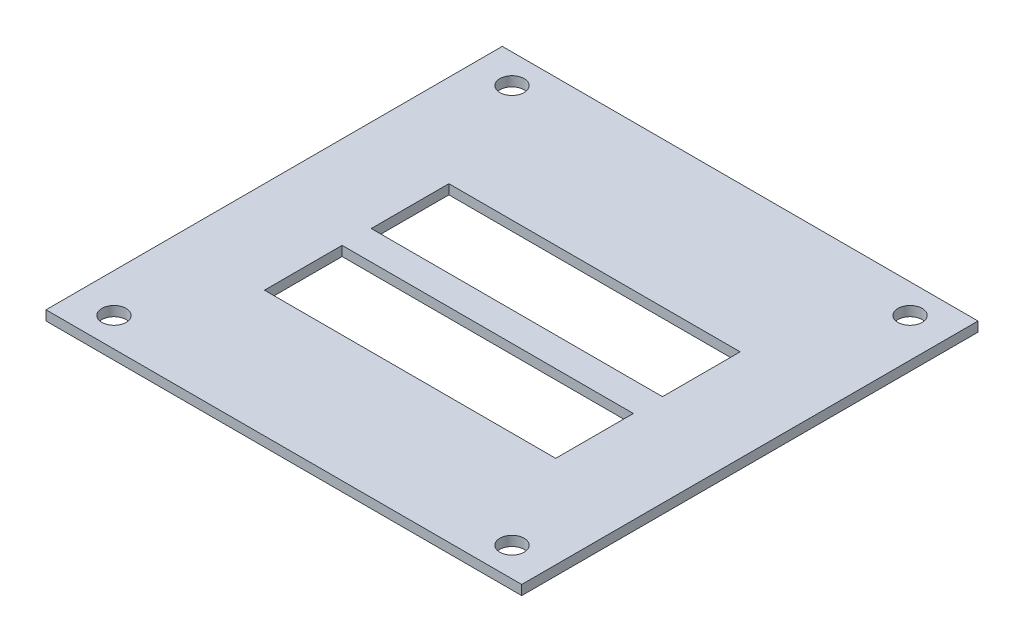
ISO-10303-21;
HEADER;
FILE_DESCRIPTION(('STEP AP214'),'2;1');
FILE_NAME('part.step','',(''),(''),'','','');
FILE_SCHEMA(('AUTOMOTIVE_DESIGN { 1 0 10303 214 1 1 1 1 }'));
ENDSEC;
DATA;
#1=APPLICATION_CONTEXT('core data for automotive mechanical design processes');
#2=APPLICATION_PROTOCOL_DEFINITION('international standard','automotive_design',2000,#1);
#3=PRODUCT_CONTEXT('',#1,'mechanical');
#4=PRODUCT('Part','Part','',(#3));
#5=PRODUCT_RELATED_PRODUCT_CATEGORY('part','',(#4));
#6=PRODUCT_DEFINITION_FORMATION('','',#4);
#7=PRODUCT_DEFINITION_CONTEXT('part definition',#1,'design');
#8=PRODUCT_DEFINITION('design','',#6,#7);
#9=PRODUCT_DEFINITION_SHAPE('','',#8);
#10=(LENGTH_UNIT() NAMED_UNIT(*) SI_UNIT(.MILLI.,.METRE.));
#11=(NAMED_UNIT(*) PLANE_ANGLE_UNIT() SI_UNIT($,.RADIAN.));
#12=(NAMED_UNIT(*) SI_UNIT($,.STERADIAN.) SOLID_ANGLE_UNIT());
#13=UNCERTAINTY_MEASURE_WITH_UNIT(LENGTH_MEASURE(1.E-05),#10,'distance_accuracy_value','');
#14=(GEOMETRIC_REPRESENTATION_CONTEXT(3) GLOBAL_UNCERTAINTY_ASSIGNED_CONTEXT((#13)) GLOBAL_UNIT_ASSIGNED_CONTEXT((#10,
#11,#12)) REPRESENTATION_CONTEXT('',''));
#15=CARTESIAN_POINT('',(0.,0.,0.));
#16=DIRECTION('',(0.,0.,1.));
#17=DIRECTION('',(1.,0.,0.));
#18=AXIS2_PLACEMENT_3D('',#15,#16,#17);
#19=CARTESIAN_POINT('',(0.,1.,-47.));
#20=DIRECTION('',(1.,0.,0.));
#21=DIRECTION('',(0.,0.,-1.));
#22=AXIS2_PLACEMENT_3D('',#19,#20,#21);
#23=PLANE('',#22);
#24=DIRECTION('',(0.,0.,1.));
#25=VECTOR('',#24,1.);
#26=CARTESIAN_POINT('',(0.,0.,-47.));
#27=LINE('',#26,#25);
#28=CARTESIAN_POINT('',(0.,0.,-47.));
#29=VERTEX_POINT('',#28);
#30=CARTESIAN_POINT('',(0.,0.,0.));
#31=VERTEX_POINT('',#30);
#32=EDGE_CURVE('E212',#29,#31,#27,.T.);
#33=ORIENTED_EDGE('',*,*,#32,.T.);
#34=DIRECTION('',(0.,-1.,0.));
#35=VECTOR('',#34,1.);
#36=CARTESIAN_POINT('',(0.,1.,0.));
#37=LINE('',#36,#35);
#38=CARTESIAN_POINT('',(0.,1.,0.));
#39=VERTEX_POINT('',#38);
#40=EDGE_CURVE('E11',#39,#31,#37,.T.);
#41=ORIENTED_EDGE('',*,*,#40,.F.);
#42=DIRECTION('',(0.,0.,1.));
#43=VECTOR('',#42,1.);
#44=CARTESIAN_POINT('',(0.,1.,-47.));
#45=LINE('',#44,#43);
#46=CARTESIAN_POINT('',(0.,1.,-47.));
#47=VERTEX_POINT('',#46);
#48=EDGE_CURVE('E213',#47,#39,#45,.T.);
#49=ORIENTED_EDGE('',*,*,#48,.F.);
#50=DIRECTION('',(0.,-1.,0.));
#51=VECTOR('',#50,1.);
#52=CARTESIAN_POINT('',(0.,1.,-47.));
#53=LINE('',#52,#51);
#54=EDGE_CURVE('E223',#47,#29,#53,.T.);
#55=ORIENTED_EDGE('',*,*,#54,.T.);
#56=EDGE_LOOP('',(#33,#41,#49,#55));
#57=FACE_BOUND('',#56,.T.);
#58=ADVANCED_FACE('F33',(#57),#23,.F.);
#59=CARTESIAN_POINT('',(0.,1.,0.));
#60=DIRECTION('',(0.,0.,-1.));
#61=DIRECTION('',(-1.,0.,0.));
#62=AXIS2_PLACEMENT_3D('',#59,#60,#61);
#63=PLANE('',#62);
#64=DIRECTION('',(1.,0.,0.));
#65=VECTOR('',#64,1.);
#66=CARTESIAN_POINT('',(0.,0.,0.));
#67=LINE('',#66,#65);
#68=CARTESIAN_POINT('',(49.,0.,0.));
#69=VERTEX_POINT('',#68);
#70=EDGE_CURVE('E226',#31,#69,#67,.T.);
#71=ORIENTED_EDGE('',*,*,#70,.T.);
#72=DIRECTION('',(0.,-1.,0.));
#73=VECTOR('',#72,1.);
#74=CARTESIAN_POINT('',(49.,1.,0.));
#75=LINE('',#74,#73);
#76=CARTESIAN_POINT('',(49.,1.,0.));
#77=VERTEX_POINT('',#76);
#78=EDGE_CURVE('E40',#77,#69,#75,.T.);
#79=ORIENTED_EDGE('',*,*,#78,.F.);
#80=DIRECTION('',(1.,0.,0.));
#81=VECTOR('',#80,1.);
#82=CARTESIAN_POINT('',(0.,1.,0.));
#83=LINE('',#82,#81);
#84=EDGE_CURVE('E216',#39,#77,#83,.T.);
#85=ORIENTED_EDGE('',*,*,#84,.F.);
#86=ORIENTED_EDGE('',*,*,#40,.T.);
#87=EDGE_LOOP('',(#71,#79,#85,#86));
#88=FACE_BOUND('',#87,.T.);
#89=ADVANCED_FACE('F255',(#88),#63,.F.);
#90=CARTESIAN_POINT('',(49.,1.,-47.));
#91=DIRECTION('',(-1.,0.,0.));
#92=DIRECTION('',(0.,0.,1.));
#93=AXIS2_PLACEMENT_3D('',#90,#91,#92);
#94=PLANE('',#93);
#95=DIRECTION('',(0.,0.,-1.));
#96=VECTOR('',#95,1.);
#97=CARTESIAN_POINT('',(49.,0.,-47.));
#98=LINE('',#97,#96);
#99=CARTESIAN_POINT('',(49.,0.,-47.));
#100=VERTEX_POINT('',#99);
#101=EDGE_CURVE('E228',#69,#100,#98,.T.);
#102=ORIENTED_EDGE('',*,*,#101,.T.);
#103=DIRECTION('',(0.,-1.,0.));
#104=VECTOR('',#103,1.);
#105=CARTESIAN_POINT('',(49.,1.,-47.));
#106=LINE('',#105,#104);
#107=CARTESIAN_POINT('',(49.,1.,-47.));
#108=VERTEX_POINT('',#107);
#109=EDGE_CURVE('E233',#108,#100,#106,.T.);
#110=ORIENTED_EDGE('',*,*,#109,.F.);
#111=DIRECTION('',(0.,0.,-1.));
#112=VECTOR('',#111,1.);
#113=CARTESIAN_POINT('',(49.,1.,-47.));
#114=LINE('',#113,#112);
#115=EDGE_CURVE('E219',#77,#108,#114,.T.);
#116=ORIENTED_EDGE('',*,*,#115,.F.);
#117=ORIENTED_EDGE('',*,*,#78,.T.);
#118=EDGE_LOOP('',(#102,#110,#116,#117));
#119=FACE_BOUND('',#118,.T.);
#120=ADVANCED_FACE('F240',(#119),#94,.F.);
#121=CARTESIAN_POINT('',(0.,1.,-47.));
#122=DIRECTION('',(0.,0.,1.));
#123=DIRECTION('',(1.,0.,0.));
#124=AXIS2_PLACEMENT_3D('',#121,#122,#123);
#125=PLANE('',#124);
#126=DIRECTION('',(-1.,0.,0.));
#127=VECTOR('',#126,1.);
#128=CARTESIAN_POINT('',(0.,0.,-47.));
#129=LINE('',#128,#127);
#130=EDGE_CURVE('E217',#100,#29,#129,.T.);
#131=ORIENTED_EDGE('',*,*,#130,.T.);
#132=ORIENTED_EDGE('',*,*,#54,.F.);
#133=DIRECTION('',(-1.,0.,0.));
#134=VECTOR('',#133,1.);
#135=CARTESIAN_POINT('',(0.,1.,-47.));
#136=LINE('',#135,#134);
#137=EDGE_CURVE('E221',#108,#47,#136,.T.);
#138=ORIENTED_EDGE('',*,*,#137,.F.);
#139=ORIENTED_EDGE('',*,*,#109,.T.);
#140=EDGE_LOOP('',(#131,#132,#138,#139));
#141=FACE_BOUND('',#140,.T.);
#142=ADVANCED_FACE('F248',(#141),#125,.F.);
#143=CARTESIAN_POINT('',(0.,1.,0.));
#144=DIRECTION('',(0.,1.,0.));
#145=DIRECTION('',(0.,0.,1.));
#146=AXIS2_PLACEMENT_3D('',#143,#144,#145);
#147=PLANE('',#146);
#148=DIRECTION('',(0.,0.,-1.));
#149=VECTOR('',#148,1.);
#150=CARTESIAN_POINT('',(39.5,1.,-32.));
#151=LINE('',#150,#149);
#152=CARTESIAN_POINT('',(39.5,1.,-24.));
#153=VERTEX_POINT('',#152);
#154=CARTESIAN_POINT('',(39.5,1.,-32.));
#155=VERTEX_POINT('',#154);
#156=EDGE_CURVE('E47',#153,#155,#151,.T.);
#157=ORIENTED_EDGE('',*,*,#156,.F.);
#158=DIRECTION('',(1.,0.,0.));
#159=VECTOR('',#158,1.);
#160=CARTESIAN_POINT('',(39.5,1.,-24.));
#161=LINE('',#160,#159);
#162=CARTESIAN_POINT('',(9.49999999999999,1.,-24.));
#163=VERTEX_POINT('',#162);
#164=EDGE_CURVE('E129',#163,#153,#161,.T.);
#165=ORIENTED_EDGE('',*,*,#164,.F.);
#166=DIRECTION('',(0.,0.,1.));
#167=VECTOR('',#166,1.);
#168=CARTESIAN_POINT('',(9.49999999999999,1.,-32.));
#169=LINE('',#168,#167);
#170=CARTESIAN_POINT('',(9.49999999999999,1.,-32.));
#171=VERTEX_POINT('',#170);
#172=EDGE_CURVE('E149',#171,#163,#169,.T.);
#173=ORIENTED_EDGE('',*,*,#172,.F.);
#174=DIRECTION('',(-1.,0.,0.));
#175=VECTOR('',#174,1.);
#176=CARTESIAN_POINT('',(39.5,1.,-32.));
#177=LINE('',#176,#175);
#178=EDGE_CURVE('E143',#155,#171,#177,.T.);
#179=ORIENTED_EDGE('',*,*,#178,.F.);
#180=EDGE_LOOP('',(#157,#165,#173,#179));
#181=FACE_BOUND('',#180,.T.);
#182=DIRECTION('',(0.,0.,-1.));
#183=VECTOR('',#182,1.);
#184=CARTESIAN_POINT('',(39.5,1.,-13.));
#185=LINE('',#184,#183);
#186=CARTESIAN_POINT('',(39.5,1.,-13.));
#187=VERTEX_POINT('',#186);
#188=CARTESIAN_POINT('',(39.5,1.,-21.));
#189=VERTEX_POINT('',#188);
#190=EDGE_CURVE('E165',#187,#189,#185,.T.);
#191=ORIENTED_EDGE('',*,*,#190,.F.);
#192=DIRECTION('',(1.,0.,0.));
#193=VECTOR('',#192,1.);
#194=CARTESIAN_POINT('',(39.5,1.,-13.));
#195=LINE('',#194,#193);
#196=CARTESIAN_POINT('',(9.49999999999999,1.,-13.));
#197=VERTEX_POINT('',#196);
#198=EDGE_CURVE('E173',#197,#187,#195,.T.);
#199=ORIENTED_EDGE('',*,*,#198,.F.);
#200=DIRECTION('',(0.,0.,1.));
#201=VECTOR('',#200,1.);
#202=CARTESIAN_POINT('',(9.49999999999999,1.,-13.));
#203=LINE('',#202,#201);
#204=CARTESIAN_POINT('',(9.49999999999999,1.,-21.));
#205=VERTEX_POINT('',#204);
#206=EDGE_CURVE('E170',#205,#197,#203,.T.);
#207=ORIENTED_EDGE('',*,*,#206,.F.);
#208=DIRECTION('',(-1.,0.,0.));
#209=VECTOR('',#208,1.);
#210=CARTESIAN_POINT('',(39.5,1.,-21.));
#211=LINE('',#210,#209);
#212=EDGE_CURVE('E167',#189,#205,#211,.T.);
#213=ORIENTED_EDGE('',*,*,#212,.F.);
#214=EDGE_LOOP('',(#191,#199,#207,#213));
#215=FACE_BOUND('',#214,.T.);
#216=CARTESIAN_POINT('',(3.99999999999999,1.,-44.));
#217=DIRECTION('',(0.,1.,0.));
#218=DIRECTION('',(0.,0.,1.));
#219=AXIS2_PLACEMENT_3D('',#216,#217,#218);
#220=CIRCLE('',#219,1.24999999999999);
#221=CARTESIAN_POINT('',(3.99999999999999,1.,-42.75));
#222=VERTEX_POINT('',#221);
#223=EDGE_CURVE('E188',#222,#222,#220,.T.);
#224=ORIENTED_EDGE('',*,*,#223,.F.);
#225=EDGE_LOOP('',(#224));
#226=FACE_BOUND('',#225,.T.);
#227=CARTESIAN_POINT('',(4.,1.,-3.));
#228=DIRECTION('',(0.,1.,0.));
#229=DIRECTION('',(0.,0.,1.));
#230=AXIS2_PLACEMENT_3D('',#227,#228,#229);
#231=CIRCLE('',#230,1.24999999999999);
#232=CARTESIAN_POINT('',(4.,1.,-1.75000000000002));
#233=VERTEX_POINT('',#232);
#234=EDGE_CURVE('E194',#233,#233,#231,.T.);
#235=ORIENTED_EDGE('',*,*,#234,.F.);
#236=EDGE_LOOP('',(#235));
#237=FACE_BOUND('',#236,.T.);
#238=CARTESIAN_POINT('',(45.,1.,-3.));
#239=DIRECTION('',(0.,1.,0.));
#240=DIRECTION('',(0.,0.,1.));
#241=AXIS2_PLACEMENT_3D('',#238,#239,#240);
#242=CIRCLE('',#241,1.24999999999999);
#243=CARTESIAN_POINT('',(45.,1.,-1.75000000000002));
#244=VERTEX_POINT('',#243);
#245=EDGE_CURVE('E200',#244,#244,#242,.T.);
#246=ORIENTED_EDGE('',*,*,#245,.F.);
#247=EDGE_LOOP('',(#246));
#248=FACE_BOUND('',#247,.T.);
#249=CARTESIAN_POINT('',(45.,1.,-44.));
#250=DIRECTION('',(0.,1.,0.));
#251=DIRECTION('',(0.,0.,1.));
#252=AXIS2_PLACEMENT_3D('',#249,#250,#251);
#253=CIRCLE('',#252,1.24999999999999);
#254=CARTESIAN_POINT('',(45.,1.,-42.75));
#255=VERTEX_POINT('',#254);
#256=EDGE_CURVE('E206',#255,#255,#253,.T.);
#257=ORIENTED_EDGE('',*,*,#256,.F.);
#258=EDGE_LOOP('',(#257));
#259=FACE_BOUND('',#258,.T.);
#260=ORIENTED_EDGE('',*,*,#48,.T.);
#261=ORIENTED_EDGE('',*,*,#84,.T.);
#262=ORIENTED_EDGE('',*,*,#115,.T.);
#263=ORIENTED_EDGE('',*,*,#137,.T.);
#264=EDGE_LOOP('',(#260,#261,#262,#263));
#265=FACE_BOUND('',#264,.T.);
#266=ADVANCED_FACE('F254',(#181,#215,#226,#237,#248,#259,#265),#147,.T.);
#267=CARTESIAN_POINT('',(0.,0.,0.));
#268=DIRECTION('',(0.,1.,0.));
#269=DIRECTION('',(0.,0.,1.));
#270=AXIS2_PLACEMENT_3D('',#267,#268,#269);
#271=PLANE('',#270);
#272=DIRECTION('',(-1.,0.,0.));
#273=VECTOR('',#272,1.);
#274=CARTESIAN_POINT('',(39.5,0.,-24.));
#275=LINE('',#274,#273);
#276=CARTESIAN_POINT('',(39.5,0.,-24.));
#277=VERTEX_POINT('',#276);
#278=CARTESIAN_POINT('',(9.49999999999999,0.,-24.));
#279=VERTEX_POINT('',#278);
#280=EDGE_CURVE('E141',#277,#279,#275,.T.);
#281=ORIENTED_EDGE('',*,*,#280,.F.);
#282=DIRECTION('',(0.,0.,1.));
#283=VECTOR('',#282,1.);
#284=CARTESIAN_POINT('',(39.5,0.,-32.));
#285=LINE('',#284,#283);
#286=CARTESIAN_POINT('',(39.5,0.,-32.));
#287=VERTEX_POINT('',#286);
#288=EDGE_CURVE('E123',#287,#277,#285,.T.);
#289=ORIENTED_EDGE('',*,*,#288,.F.);
#290=DIRECTION('',(1.,0.,0.));
#291=VECTOR('',#290,1.);
#292=CARTESIAN_POINT('',(39.5,0.,-32.));
#293=LINE('',#292,#291);
#294=CARTESIAN_POINT('',(9.49999999999999,0.,-32.));
#295=VERTEX_POINT('',#294);
#296=EDGE_CURVE('E132',#295,#287,#293,.T.);
#297=ORIENTED_EDGE('',*,*,#296,.F.);
#298=DIRECTION('',(0.,0.,-1.));
#299=VECTOR('',#298,1.);
#300=CARTESIAN_POINT('',(9.49999999999999,0.,-32.));
#301=LINE('',#300,#299);
#302=EDGE_CURVE('E55',#279,#295,#301,.T.);
#303=ORIENTED_EDGE('',*,*,#302,.F.);
#304=EDGE_LOOP('',(#281,#289,#297,#303));
#305=FACE_BOUND('',#304,.T.);
#306=DIRECTION('',(-1.,0.,0.));
#307=VECTOR('',#306,1.);
#308=CARTESIAN_POINT('',(39.5,0.,-13.));
#309=LINE('',#308,#307);
#310=CARTESIAN_POINT('',(39.5,0.,-13.));
#311=VERTEX_POINT('',#310);
#312=CARTESIAN_POINT('',(9.49999999999999,0.,-13.));
#313=VERTEX_POINT('',#312);
#314=EDGE_CURVE('E159',#311,#313,#309,.T.);
#315=ORIENTED_EDGE('',*,*,#314,.F.);
#316=DIRECTION('',(0.,0.,1.));
#317=VECTOR('',#316,1.);
#318=CARTESIAN_POINT('',(39.5,0.,-13.));
#319=LINE('',#318,#317);
#320=CARTESIAN_POINT('',(39.5,0.,-21.));
#321=VERTEX_POINT('',#320);
#322=EDGE_CURVE('E162',#321,#311,#319,.T.);
#323=ORIENTED_EDGE('',*,*,#322,.F.);
#324=DIRECTION('',(1.,0.,0.));
#325=VECTOR('',#324,1.);
#326=CARTESIAN_POINT('',(39.5,0.,-21.));
#327=LINE('',#326,#325);
#328=CARTESIAN_POINT('',(9.49999999999999,0.,-21.));
#329=VERTEX_POINT('',#328);
#330=EDGE_CURVE('E179',#329,#321,#327,.T.);
#331=ORIENTED_EDGE('',*,*,#330,.F.);
#332=DIRECTION('',(0.,0.,-1.));
#333=VECTOR('',#332,1.);
#334=CARTESIAN_POINT('',(9.49999999999999,0.,-13.));
#335=LINE('',#334,#333);
#336=EDGE_CURVE('E135',#313,#329,#335,.T.);
#337=ORIENTED_EDGE('',*,*,#336,.F.);
#338=EDGE_LOOP('',(#315,#323,#331,#337));
#339=FACE_BOUND('',#338,.T.);
#340=CARTESIAN_POINT('',(3.99999999999999,0.,-44.));
#341=DIRECTION('',(0.,1.,0.));
#342=DIRECTION('',(0.,0.,1.));
#343=AXIS2_PLACEMENT_3D('',#340,#341,#342);
#344=CIRCLE('',#343,1.24999999999999);
#345=CARTESIAN_POINT('',(3.99999999999999,0.,-42.75));
#346=VERTEX_POINT('',#345);
#347=EDGE_CURVE('E191',#346,#346,#344,.T.);
#348=ORIENTED_EDGE('',*,*,#347,.T.);
#349=EDGE_LOOP('',(#348));
#350=FACE_BOUND('',#349,.T.);
#351=CARTESIAN_POINT('',(4.,0.,-3.));
#352=DIRECTION('',(0.,1.,0.));
#353=DIRECTION('',(0.,0.,1.));
#354=AXIS2_PLACEMENT_3D('',#351,#352,#353);
#355=CIRCLE('',#354,1.24999999999999);
#356=CARTESIAN_POINT('',(4.,0.,-1.75000000000001));
#357=VERTEX_POINT('',#356);
#358=EDGE_CURVE('E197',#357,#357,#355,.T.);
#359=ORIENTED_EDGE('',*,*,#358,.T.);
#360=EDGE_LOOP('',(#359));
#361=FACE_BOUND('',#360,.T.);
#362=CARTESIAN_POINT('',(45.,0.,-3.));
#363=DIRECTION('',(0.,1.,0.));
#364=DIRECTION('',(0.,0.,1.));
#365=AXIS2_PLACEMENT_3D('',#362,#363,#364);
#366=CIRCLE('',#365,1.24999999999999);
#367=CARTESIAN_POINT('',(45.,0.,-1.75000000000001));
#368=VERTEX_POINT('',#367);
#369=EDGE_CURVE('E203',#368,#368,#366,.T.);
#370=ORIENTED_EDGE('',*,*,#369,.T.);
#371=EDGE_LOOP('',(#370));
#372=FACE_BOUND('',#371,.T.);
#373=CARTESIAN_POINT('',(45.,0.,-44.));
#374=DIRECTION('',(0.,1.,0.));
#375=DIRECTION('',(0.,0.,1.));
#376=AXIS2_PLACEMENT_3D('',#373,#374,#375);
#377=CIRCLE('',#376,1.24999999999999);
#378=CARTESIAN_POINT('',(45.,0.,-42.75));
#379=VERTEX_POINT('',#378);
#380=EDGE_CURVE('E209',#379,#379,#377,.T.);
#381=ORIENTED_EDGE('',*,*,#380,.T.);
#382=EDGE_LOOP('',(#381));
#383=FACE_BOUND('',#382,.T.);
#384=ORIENTED_EDGE('',*,*,#32,.F.);
#385=ORIENTED_EDGE('',*,*,#130,.F.);
#386=ORIENTED_EDGE('',*,*,#101,.F.);
#387=ORIENTED_EDGE('',*,*,#70,.F.);
#388=EDGE_LOOP('',(#384,#385,#386,#387));
#389=FACE_BOUND('',#388,.T.);
#390=ADVANCED_FACE('F138',(#305,#339,#350,#361,#372,#383,#389),#271,.F.);
#391=CARTESIAN_POINT('',(45.,1.,-44.));
#392=DIRECTION('',(0.,1.,0.));
#393=DIRECTION('',(0.,0.,1.));
#394=AXIS2_PLACEMENT_3D('',#391,#392,#393);
#395=CYLINDRICAL_SURFACE('',#394,1.24999999999999);
#396=ORIENTED_EDGE('',*,*,#380,.F.);
#397=EDGE_LOOP('',(#396));
#398=FACE_BOUND('',#397,.T.);
#399=ORIENTED_EDGE('',*,*,#256,.T.);
#400=EDGE_LOOP('',(#399));
#401=FACE_BOUND('',#400,.T.);
#402=ADVANCED_FACE('F267',(#398,#401),#395,.F.);
#403=CARTESIAN_POINT('',(45.,1.,-3.));
#404=DIRECTION('',(0.,1.,0.));
#405=DIRECTION('',(0.,0.,1.));
#406=AXIS2_PLACEMENT_3D('',#403,#404,#405);
#407=CYLINDRICAL_SURFACE('',#406,1.24999999999999);
#408=ORIENTED_EDGE('',*,*,#369,.F.);
#409=EDGE_LOOP('',(#408));
#410=FACE_BOUND('',#409,.T.);
#411=ORIENTED_EDGE('',*,*,#245,.T.);
#412=EDGE_LOOP('',(#411));
#413=FACE_BOUND('',#412,.T.);
#414=ADVANCED_FACE('F273',(#410,#413),#407,.F.);
#415=CARTESIAN_POINT('',(4.,1.,-3.));
#416=DIRECTION('',(0.,1.,0.));
#417=DIRECTION('',(0.,0.,1.));
#418=AXIS2_PLACEMENT_3D('',#415,#416,#417);
#419=CYLINDRICAL_SURFACE('',#418,1.24999999999999);
#420=ORIENTED_EDGE('',*,*,#358,.F.);
#421=EDGE_LOOP('',(#420));
#422=FACE_BOUND('',#421,.T.);
#423=ORIENTED_EDGE('',*,*,#234,.T.);
#424=EDGE_LOOP('',(#423));
#425=FACE_BOUND('',#424,.T.);
#426=ADVANCED_FACE('F277',(#422,#425),#419,.F.);
#427=CARTESIAN_POINT('',(3.99999999999999,1.,-44.));
#428=DIRECTION('',(0.,1.,0.));
#429=DIRECTION('',(0.,0.,1.));
#430=AXIS2_PLACEMENT_3D('',#427,#428,#429);
#431=CYLINDRICAL_SURFACE('',#430,1.24999999999999);
#432=ORIENTED_EDGE('',*,*,#347,.F.);
#433=EDGE_LOOP('',(#432));
#434=FACE_BOUND('',#433,.T.);
#435=ORIENTED_EDGE('',*,*,#223,.T.);
#436=EDGE_LOOP('',(#435));
#437=FACE_BOUND('',#436,.T.);
#438=ADVANCED_FACE('F281',(#434,#437),#431,.F.);
#439=CARTESIAN_POINT('',(39.5,-0.000999999999999916,-13.));
#440=DIRECTION('',(1.,0.,0.));
#441=DIRECTION('',(0.,0.,-1.));
#442=AXIS2_PLACEMENT_3D('',#439,#440,#441);
#443=PLANE('',#442);
#444=ORIENTED_EDGE('',*,*,#322,.T.);
#445=DIRECTION('',(0.,1.,0.));
#446=VECTOR('',#445,1.);
#447=CARTESIAN_POINT('',(39.5,-0.000999999999999916,-13.));
#448=LINE('',#447,#446);
#449=EDGE_CURVE('E177',#311,#187,#448,.T.);
#450=ORIENTED_EDGE('',*,*,#449,.T.);
#451=ORIENTED_EDGE('',*,*,#190,.T.);
#452=DIRECTION('',(0.,1.,0.));
#453=VECTOR('',#452,1.);
#454=CARTESIAN_POINT('',(39.5,-0.000999999999999916,-21.));
#455=LINE('',#454,#453);
#456=EDGE_CURVE('E176',#321,#189,#455,.T.);
#457=ORIENTED_EDGE('',*,*,#456,.F.);
#458=EDGE_LOOP('',(#444,#450,#451,#457));
#459=FACE_BOUND('',#458,.T.);
#460=ADVANCED_FACE('F285',(#459),#443,.F.);
#461=CARTESIAN_POINT('',(39.5,-0.000999999999999916,-13.));
#462=DIRECTION('',(0.,0.,1.));
#463=DIRECTION('',(1.,0.,0.));
#464=AXIS2_PLACEMENT_3D('',#461,#462,#463);
#465=PLANE('',#464);
#466=ORIENTED_EDGE('',*,*,#314,.T.);
#467=DIRECTION('',(0.,1.,0.));
#468=VECTOR('',#467,1.);
#469=CARTESIAN_POINT('',(9.49999999999999,-0.000999999999999916,-13.));
#470=LINE('',#469,#468);
#471=EDGE_CURVE('E180',#313,#197,#470,.T.);
#472=ORIENTED_EDGE('',*,*,#471,.T.);
#473=ORIENTED_EDGE('',*,*,#198,.T.);
#474=ORIENTED_EDGE('',*,*,#449,.F.);
#475=EDGE_LOOP('',(#466,#472,#473,#474));
#476=FACE_BOUND('',#475,.T.);
#477=ADVANCED_FACE('F289',(#476),#465,.F.);
#478=CARTESIAN_POINT('',(9.49999999999999,-0.000999999999999916,-13.));
#479=DIRECTION('',(-1.,0.,0.));
#480=DIRECTION('',(0.,0.,1.));
#481=AXIS2_PLACEMENT_3D('',#478,#479,#480);
#482=PLANE('',#481);
#483=ORIENTED_EDGE('',*,*,#336,.T.);
#484=DIRECTION('',(0.,1.,0.));
#485=VECTOR('',#484,1.);
#486=CARTESIAN_POINT('',(9.49999999999999,-0.000999999999999916,-21.));
#487=LINE('',#486,#485);
#488=EDGE_CURVE('E182',#329,#205,#487,.T.);
#489=ORIENTED_EDGE('',*,*,#488,.T.);
#490=ORIENTED_EDGE('',*,*,#206,.T.);
#491=ORIENTED_EDGE('',*,*,#471,.F.);
#492=EDGE_LOOP('',(#483,#489,#490,#491));
#493=FACE_BOUND('',#492,.T.);
#494=ADVANCED_FACE('F294',(#493),#482,.F.);
#495=CARTESIAN_POINT('',(39.5,-0.000999999999999916,-21.));
#496=DIRECTION('',(0.,0.,-1.));
#497=DIRECTION('',(-1.,0.,0.));
#498=AXIS2_PLACEMENT_3D('',#495,#496,#497);
#499=PLANE('',#498);
#500=ORIENTED_EDGE('',*,*,#330,.T.);
#501=ORIENTED_EDGE('',*,*,#456,.T.);
#502=ORIENTED_EDGE('',*,*,#212,.T.);
#503=ORIENTED_EDGE('',*,*,#488,.F.);
#504=EDGE_LOOP('',(#500,#501,#502,#503));
#505=FACE_BOUND('',#504,.T.);
#506=ADVANCED_FACE('F291',(#505),#499,.F.);
#507=CARTESIAN_POINT('',(39.5,-0.000999999999999916,-32.));
#508=DIRECTION('',(1.,0.,0.));
#509=DIRECTION('',(0.,0.,-1.));
#510=AXIS2_PLACEMENT_3D('',#507,#508,#509);
#511=PLANE('',#510);
#512=ORIENTED_EDGE('',*,*,#288,.T.);
#513=DIRECTION('',(0.,1.,0.));
#514=VECTOR('',#513,1.);
#515=CARTESIAN_POINT('',(39.5,-0.000999999999999916,-24.));
#516=LINE('',#515,#514);
#517=EDGE_CURVE('E136',#277,#153,#516,.T.);
#518=ORIENTED_EDGE('',*,*,#517,.T.);
#519=ORIENTED_EDGE('',*,*,#156,.T.);
#520=DIRECTION('',(0.,1.,0.));
#521=VECTOR('',#520,1.);
#522=CARTESIAN_POINT('',(39.5,-0.000999999999999916,-32.));
#523=LINE('',#522,#521);
#524=EDGE_CURVE('E119',#287,#155,#523,.T.);
#525=ORIENTED_EDGE('',*,*,#524,.F.);
#526=EDGE_LOOP('',(#512,#518,#519,#525));
#527=FACE_BOUND('',#526,.T.);
#528=ADVANCED_FACE('F121',(#527),#511,.F.);
#529=CARTESIAN_POINT('',(39.5,-0.000999999999999916,-24.));
#530=DIRECTION('',(0.,0.,1.));
#531=DIRECTION('',(1.,0.,0.));
#532=AXIS2_PLACEMENT_3D('',#529,#530,#531);
#533=PLANE('',#532);
#534=ORIENTED_EDGE('',*,*,#280,.T.);
#535=DIRECTION('',(0.,1.,0.));
#536=VECTOR('',#535,1.);
#537=CARTESIAN_POINT('',(9.49999999999999,-0.000999999999999916,-24.));
#538=LINE('',#537,#536);
#539=EDGE_CURVE('E155',#279,#163,#538,.T.);
#540=ORIENTED_EDGE('',*,*,#539,.T.);
#541=ORIENTED_EDGE('',*,*,#164,.T.);
#542=ORIENTED_EDGE('',*,*,#517,.F.);
#543=EDGE_LOOP('',(#534,#540,#541,#542));
#544=FACE_BOUND('',#543,.T.);
#545=ADVANCED_FACE('F304',(#544),#533,.F.);
#546=CARTESIAN_POINT('',(9.49999999999999,-0.000999999999999916,-32.));
#547=DIRECTION('',(-1.,0.,0.));
#548=DIRECTION('',(0.,0.,1.));
#549=AXIS2_PLACEMENT_3D('',#546,#547,#548);
#550=PLANE('',#549);
#551=ORIENTED_EDGE('',*,*,#302,.T.);
#552=DIRECTION('',(0.,1.,0.));
#553=VECTOR('',#552,1.);
#554=CARTESIAN_POINT('',(9.49999999999999,-0.000999999999999916,-32.));
#555=LINE('',#554,#553);
#556=EDGE_CURVE('E128',#295,#171,#555,.T.);
#557=ORIENTED_EDGE('',*,*,#556,.T.);
#558=ORIENTED_EDGE('',*,*,#172,.T.);
#559=ORIENTED_EDGE('',*,*,#539,.F.);
#560=EDGE_LOOP('',(#551,#557,#558,#559));
#561=FACE_BOUND('',#560,.T.);
#562=ADVANCED_FACE('F307',(#561),#550,.F.);
#563=CARTESIAN_POINT('',(39.5,-0.000999999999999916,-32.));
#564=DIRECTION('',(0.,0.,-1.));
#565=DIRECTION('',(-1.,0.,0.));
#566=AXIS2_PLACEMENT_3D('',#563,#564,#565);
#567=PLANE('',#566);
#568=ORIENTED_EDGE('',*,*,#296,.T.);
#569=ORIENTED_EDGE('',*,*,#524,.T.);
#570=ORIENTED_EDGE('',*,*,#178,.T.);
#571=ORIENTED_EDGE('',*,*,#556,.F.);
#572=EDGE_LOOP('',(#568,#569,#570,#571));
#573=FACE_BOUND('',#572,.T.);
#574=ADVANCED_FACE('F133',(#573),#567,.F.);
#575=CLOSED_SHELL('',(#58,#89,#120,#142,#266,#390,#402,#414,#426,#438,#460,#477,#494,#506,#528,
#545,#562,#574));
#576=MANIFOLD_SOLID_BREP('B2',#575);
#577=ADVANCED_BREP_SHAPE_REPRESENTATION('',(#18,#576),#14);
#578=SHAPE_DEFINITION_REPRESENTATION(#9,#577);
ENDSEC;
END-ISO-10303-21;
